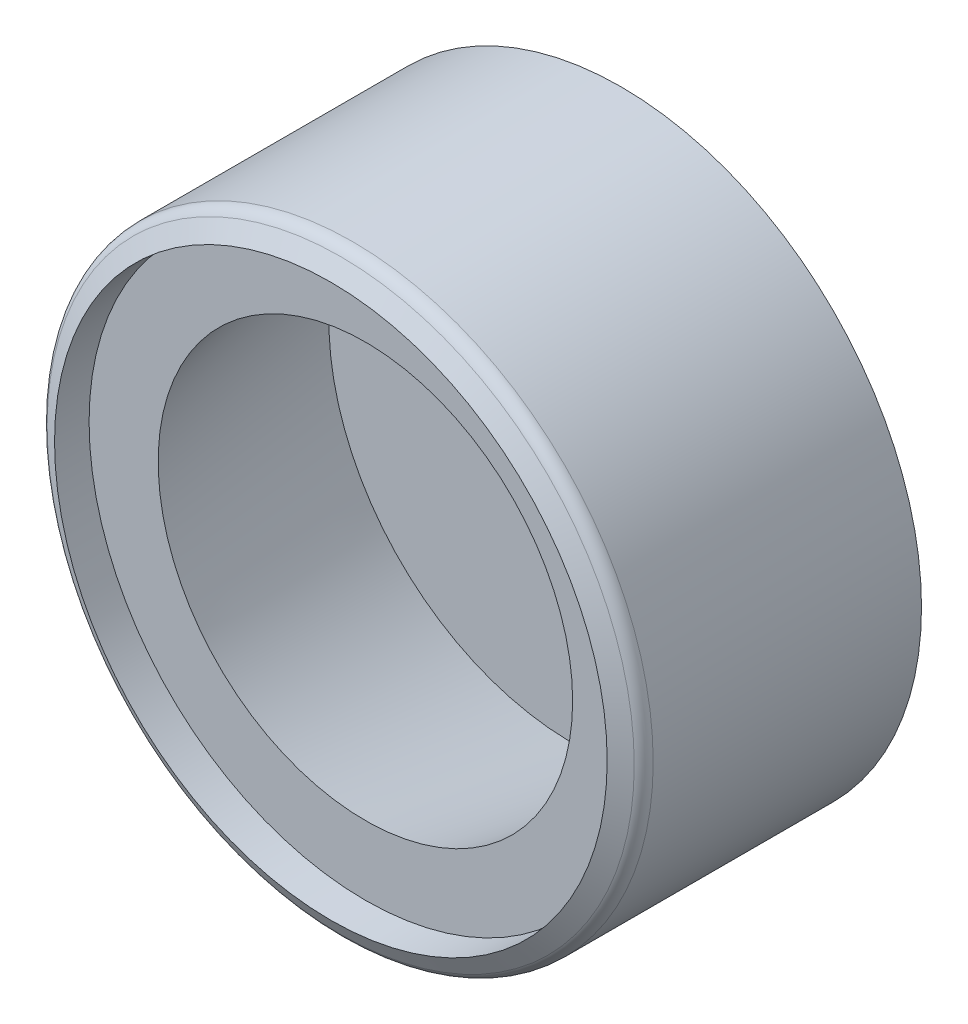
ISO-10303-21;
HEADER;
FILE_DESCRIPTION(('STEP AP214'),'2;1');
FILE_NAME('part.step','',(''),(''),'','','');
FILE_SCHEMA(('AUTOMOTIVE_DESIGN { 1 0 10303 214 1 1 1 1 }'));
ENDSEC;
DATA;
#1=APPLICATION_CONTEXT('core data for automotive mechanical design processes');
#2=APPLICATION_PROTOCOL_DEFINITION('international standard','automotive_design',2000,#1);
#3=PRODUCT_CONTEXT('',#1,'mechanical');
#4=PRODUCT('Part','Part','',(#3));
#5=PRODUCT_RELATED_PRODUCT_CATEGORY('part','',(#4));
#6=PRODUCT_DEFINITION_FORMATION('','',#4);
#7=PRODUCT_DEFINITION_CONTEXT('part definition',#1,'design');
#8=PRODUCT_DEFINITION('design','',#6,#7);
#9=PRODUCT_DEFINITION_SHAPE('','',#8);
#10=(LENGTH_UNIT() NAMED_UNIT(*) SI_UNIT(.MILLI.,.METRE.));
#11=(NAMED_UNIT(*) PLANE_ANGLE_UNIT() SI_UNIT($,.RADIAN.));
#12=(NAMED_UNIT(*) SI_UNIT($,.STERADIAN.) SOLID_ANGLE_UNIT());
#13=UNCERTAINTY_MEASURE_WITH_UNIT(LENGTH_MEASURE(1.E-05),#10,'distance_accuracy_value','');
#14=(GEOMETRIC_REPRESENTATION_CONTEXT(3) GLOBAL_UNCERTAINTY_ASSIGNED_CONTEXT((#13)) GLOBAL_UNIT_ASSIGNED_CONTEXT((#10,
#11,#12)) REPRESENTATION_CONTEXT('',''));
#15=CARTESIAN_POINT('',(0.,0.,0.));
#16=DIRECTION('',(0.,0.,1.));
#17=DIRECTION('',(1.,0.,0.));
#18=AXIS2_PLACEMENT_3D('',#15,#16,#17);
#19=CARTESIAN_POINT('',(0.,0.,-247.65));
#20=DIRECTION('',(0.,0.,1.));
#21=DIRECTION('',(1.,0.,0.));
#22=AXIS2_PLACEMENT_3D('',#19,#20,#21);
#23=CYLINDRICAL_SURFACE('',#22,55.245);
#24=CARTESIAN_POINT('',(0.,0.,-190.704019240097));
#25=DIRECTION('',(0.,0.,1.));
#26=DIRECTION('',(1.,0.,0.));
#27=AXIS2_PLACEMENT_3D('',#24,#25,#26);
#28=CIRCLE('',#27,55.245);
#29=CARTESIAN_POINT('',(55.245,0.,-190.704019240097));
#30=VERTEX_POINT('',#29);
#31=EDGE_CURVE('E10',#30,#30,#28,.F.);
#32=ORIENTED_EDGE('',*,*,#31,.T.);
#33=EDGE_LOOP('',(#32));
#34=FACE_BOUND('',#33,.T.);
#35=CARTESIAN_POINT('',(0.,0.,-240.03));
#36=DIRECTION('',(0.,0.,-1.));
#37=DIRECTION('',(-1.,0.,0.));
#38=AXIS2_PLACEMENT_3D('',#35,#36,#37);
#39=CIRCLE('',#38,55.245);
#40=CARTESIAN_POINT('',(-55.245,0.,-240.03));
#41=VERTEX_POINT('',#40);
#42=EDGE_CURVE('E21',#41,#41,#39,.F.);
#43=ORIENTED_EDGE('',*,*,#42,.T.);
#44=EDGE_LOOP('',(#43));
#45=FACE_BOUND('',#44,.T.);
#46=ADVANCED_FACE('F15',(#34,#45),#23,.T.);
#47=CARTESIAN_POINT('',(0.,0.,-247.65));
#48=DIRECTION('',(0.,0.,-1.));
#49=DIRECTION('',(1.,0.,0.));
#50=AXIS2_PLACEMENT_3D('',#47,#48,#49);
#51=PLANE('',#50);
#52=CARTESIAN_POINT('',(0.,0.,-247.65));
#53=DIRECTION('',(0.,0.,-1.));
#54=DIRECTION('',(-1.,0.,0.));
#55=AXIS2_PLACEMENT_3D('',#52,#53,#54);
#56=CIRCLE('',#55,42.545);
#57=CARTESIAN_POINT('',(-42.545,0.,-247.65));
#58=VERTEX_POINT('',#57);
#59=EDGE_CURVE('E25',#58,#58,#56,.T.);
#60=ORIENTED_EDGE('',*,*,#59,.T.);
#61=EDGE_LOOP('',(#60));
#62=FACE_BOUND('',#61,.T.);
#63=ADVANCED_FACE('F80',(#62),#51,.T.);
#64=CARTESIAN_POINT('',(0.,0.,-247.65));
#65=DIRECTION('',(0.,0.,1.));
#66=DIRECTION('',(1.,0.,0.));
#67=AXIS2_PLACEMENT_3D('',#64,#65,#66);
#68=CONICAL_SURFACE('',#67,42.545,1.03037682652431);
#69=ORIENTED_EDGE('',*,*,#42,.F.);
#70=EDGE_LOOP('',(#69));
#71=FACE_BOUND('',#70,.T.);
#72=ORIENTED_EDGE('',*,*,#59,.F.);
#73=EDGE_LOOP('',(#72));
#74=FACE_BOUND('',#73,.T.);
#75=ADVANCED_FACE('F70',(#71,#74),#68,.T.);
#76=CARTESIAN_POINT('',(0.,0.,-189.23));
#77=DIRECTION('',(0.,0.,-1.));
#78=DIRECTION('',(-1.,0.,0.));
#79=AXIS2_PLACEMENT_3D('',#76,#77,#78);
#80=CONICAL_SURFACE('',#79,55.245,1.05165021254837);
#81=CARTESIAN_POINT('',(0.,0.,-188.498681659101));
#82=DIRECTION('',(0.,0.,-1.));
#83=DIRECTION('',(-1.,0.,0.));
#84=AXIS2_PLACEMENT_3D('',#81,#82,#83);
#85=CIRCLE('',#84,53.9651929034264);
#86=CARTESIAN_POINT('',(-53.9651929034264,0.,-188.498681659101));
#87=VERTEX_POINT('',#86);
#88=EDGE_CURVE('E29',#87,#87,#85,.F.);
#89=ORIENTED_EDGE('',*,*,#88,.T.);
#90=EDGE_LOOP('',(#89));
#91=FACE_BOUND('',#90,.T.);
#92=CARTESIAN_POINT('',(0.,0.,-186.69));
#93=DIRECTION('',(0.,0.,-1.));
#94=DIRECTION('',(-1.,0.,0.));
#95=AXIS2_PLACEMENT_3D('',#92,#93,#94);
#96=CIRCLE('',#95,50.8);
#97=CARTESIAN_POINT('',(-50.8,0.,-186.69));
#98=VERTEX_POINT('',#97);
#99=EDGE_CURVE('E34',#98,#98,#96,.F.);
#100=ORIENTED_EDGE('',*,*,#99,.F.);
#101=EDGE_LOOP('',(#100));
#102=FACE_BOUND('',#101,.T.);
#103=ADVANCED_FACE('F68',(#91,#102),#80,.T.);
#104=CARTESIAN_POINT('',(0.,0.,-190.704019240097));
#105=DIRECTION('',(0.,0.,1.));
#106=DIRECTION('',(1.,0.,0.));
#107=AXIS2_PLACEMENT_3D('',#104,#105,#106);
#108=TOROIDAL_SURFACE('',#107,52.705,2.54);
#109=ORIENTED_EDGE('',*,*,#88,.F.);
#110=EDGE_LOOP('',(#109));
#111=FACE_BOUND('',#110,.T.);
#112=ORIENTED_EDGE('',*,*,#31,.F.);
#113=EDGE_LOOP('',(#112));
#114=FACE_BOUND('',#113,.T.);
#115=ADVANCED_FACE('F64',(#111,#114),#108,.T.);
#116=CARTESIAN_POINT('',(0.,0.,-193.04));
#117=DIRECTION('',(0.,0.,1.));
#118=DIRECTION('',(1.,0.,0.));
#119=AXIS2_PLACEMENT_3D('',#116,#117,#118);
#120=CYLINDRICAL_SURFACE('',#119,50.8);
#121=CARTESIAN_POINT('',(0.,0.,-193.04));
#122=DIRECTION('',(0.,0.,-1.));
#123=DIRECTION('',(-1.,0.,0.));
#124=AXIS2_PLACEMENT_3D('',#121,#122,#123);
#125=CIRCLE('',#124,50.8);
#126=CARTESIAN_POINT('',(-50.8,0.,-193.04));
#127=VERTEX_POINT('',#126);
#128=EDGE_CURVE('E37',#127,#127,#125,.F.);
#129=ORIENTED_EDGE('',*,*,#128,.F.);
#130=EDGE_LOOP('',(#129));
#131=FACE_BOUND('',#130,.T.);
#132=ORIENTED_EDGE('',*,*,#99,.T.);
#133=EDGE_LOOP('',(#132));
#134=FACE_BOUND('',#133,.T.);
#135=ADVANCED_FACE('F58',(#131,#134),#120,.F.);
#136=CARTESIAN_POINT('',(0.,0.,-193.04));
#137=DIRECTION('',(0.,0.,1.));
#138=DIRECTION('',(1.,0.,0.));
#139=AXIS2_PLACEMENT_3D('',#136,#137,#138);
#140=PLANE('',#139);
#141=CARTESIAN_POINT('',(0.,0.,-193.04));
#142=DIRECTION('',(0.,0.,1.));
#143=DIRECTION('',(1.,0.,0.));
#144=AXIS2_PLACEMENT_3D('',#141,#142,#143);
#145=CIRCLE('',#144,38.1);
#146=CARTESIAN_POINT('',(38.1,0.,-193.04));
#147=VERTEX_POINT('',#146);
#148=EDGE_CURVE('E40',#147,#147,#145,.T.);
#149=ORIENTED_EDGE('',*,*,#148,.F.);
#150=EDGE_LOOP('',(#149));
#151=FACE_BOUND('',#150,.T.);
#152=ORIENTED_EDGE('',*,*,#128,.T.);
#153=EDGE_LOOP('',(#152));
#154=FACE_BOUND('',#153,.T.);
#155=ADVANCED_FACE('F52',(#151,#154),#140,.T.);
#156=CARTESIAN_POINT('',(0.,0.,-193.04));
#157=DIRECTION('',(0.,0.,-1.));
#158=DIRECTION('',(-1.,0.,0.));
#159=AXIS2_PLACEMENT_3D('',#156,#157,#158);
#160=CONICAL_SURFACE('',#159,38.1,0.174532925199433);
#161=CARTESIAN_POINT('',(0.,0.,-231.14));
#162=DIRECTION('',(0.,0.,1.));
#163=DIRECTION('',(1.,0.,0.));
#164=AXIS2_PLACEMENT_3D('',#161,#162,#163);
#165=CIRCLE('',#164,44.8180579649925);
#166=CARTESIAN_POINT('',(44.8180579649925,0.,-231.14));
#167=VERTEX_POINT('',#166);
#168=EDGE_CURVE('E43',#167,#167,#165,.T.);
#169=ORIENTED_EDGE('',*,*,#168,.F.);
#170=EDGE_LOOP('',(#169));
#171=FACE_BOUND('',#170,.T.);
#172=ORIENTED_EDGE('',*,*,#148,.T.);
#173=EDGE_LOOP('',(#172));
#174=FACE_BOUND('',#173,.T.);
#175=ADVANCED_FACE('F49',(#171,#174),#160,.F.);
#176=CARTESIAN_POINT('',(0.,0.,-231.14));
#177=DIRECTION('',(0.,0.,1.));
#178=DIRECTION('',(1.,0.,0.));
#179=AXIS2_PLACEMENT_3D('',#176,#177,#178);
#180=PLANE('',#179);
#181=ORIENTED_EDGE('',*,*,#168,.T.);
#182=EDGE_LOOP('',(#181));
#183=FACE_BOUND('',#182,.T.);
#184=ADVANCED_FACE('F47',(#183),#180,.T.);
#185=CLOSED_SHELL('',(#46,#63,#75,#103,#115,#135,#155,#175,#184));
#186=MANIFOLD_SOLID_BREP('B1',#185);
#187=ADVANCED_BREP_SHAPE_REPRESENTATION('',(#18,#186),#14);
#188=SHAPE_DEFINITION_REPRESENTATION(#9,#187);
ENDSEC;
END-ISO-10303-21;
